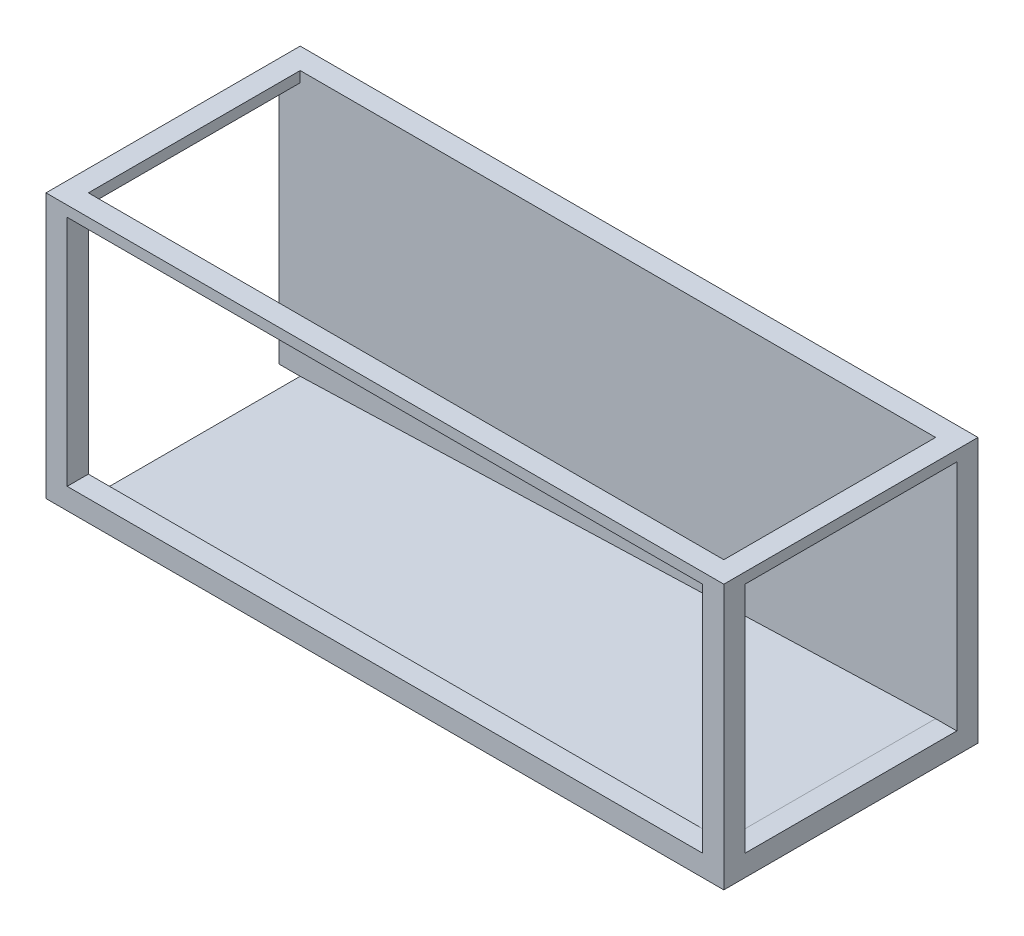
ISO-10303-21;
HEADER;
FILE_DESCRIPTION(('STEP AP214'),'2;1');
FILE_NAME('part.step','',(''),(''),'','','');
FILE_SCHEMA(('AUTOMOTIVE_DESIGN { 1 0 10303 214 1 1 1 1 }'));
ENDSEC;
DATA;
#1=APPLICATION_CONTEXT('core data for automotive mechanical design processes');
#2=APPLICATION_PROTOCOL_DEFINITION('international standard','automotive_design',2000,#1);
#3=PRODUCT_CONTEXT('',#1,'mechanical');
#4=PRODUCT('Part','Part','',(#3));
#5=PRODUCT_RELATED_PRODUCT_CATEGORY('part','',(#4));
#6=PRODUCT_DEFINITION_FORMATION('','',#4);
#7=PRODUCT_DEFINITION_CONTEXT('part definition',#1,'design');
#8=PRODUCT_DEFINITION('design','',#6,#7);
#9=PRODUCT_DEFINITION_SHAPE('','',#8);
#10=(LENGTH_UNIT() NAMED_UNIT(*) SI_UNIT(.MILLI.,.METRE.));
#11=(NAMED_UNIT(*) PLANE_ANGLE_UNIT() SI_UNIT($,.RADIAN.));
#12=(NAMED_UNIT(*) SI_UNIT($,.STERADIAN.) SOLID_ANGLE_UNIT());
#13=UNCERTAINTY_MEASURE_WITH_UNIT(LENGTH_MEASURE(1.E-05),#10,'distance_accuracy_value','');
#14=(GEOMETRIC_REPRESENTATION_CONTEXT(3) GLOBAL_UNCERTAINTY_ASSIGNED_CONTEXT((#13)) GLOBAL_UNIT_ASSIGNED_CONTEXT((#10,
#11,#12)) REPRESENTATION_CONTEXT('',''));
#15=CARTESIAN_POINT('',(0.,0.,0.));
#16=DIRECTION('',(0.,0.,1.));
#17=DIRECTION('',(1.,0.,0.));
#18=AXIS2_PLACEMENT_3D('',#15,#16,#17);
#19=CARTESIAN_POINT('',(-190.5,12.7,-63.5));
#20=DIRECTION('',(0.,0.,1.));
#21=DIRECTION('',(1.,0.,0.));
#22=AXIS2_PLACEMENT_3D('',#19,#20,#21);
#23=PLANE('',#22);
#24=DIRECTION('',(-1.,0.,0.));
#25=VECTOR('',#24,1.);
#26=CARTESIAN_POINT('',(-190.5,0.,-63.5));
#27=LINE('',#26,#25);
#28=CARTESIAN_POINT('',(-190.5,0.,-63.5));
#29=VERTEX_POINT('',#28);
#30=CARTESIAN_POINT('',(-203.2,0.,-63.5));
#31=VERTEX_POINT('',#30);
#32=EDGE_CURVE('E182',#29,#31,#27,.T.);
#33=ORIENTED_EDGE('',*,*,#32,.F.);
#34=DIRECTION('',(-0.999444906979154,-0.0333148302326385,0.));
#35=VECTOR('',#34,1.);
#36=CARTESIAN_POINT('',(190.5,12.7,-63.5));
#37=LINE('',#36,#35);
#38=CARTESIAN_POINT('',(190.5,12.7,-63.5));
#39=VERTEX_POINT('',#38);
#40=EDGE_CURVE('E167',#39,#29,#37,.T.);
#41=ORIENTED_EDGE('',*,*,#40,.F.);
#42=DIRECTION('',(1.,0.,0.));
#43=VECTOR('',#42,1.);
#44=CARTESIAN_POINT('',(0.,12.7,-63.5));
#45=LINE('',#44,#43);
#46=CARTESIAN_POINT('',(203.2,12.7,-63.5));
#47=VERTEX_POINT('',#46);
#48=EDGE_CURVE('E181',#39,#47,#45,.T.);
#49=ORIENTED_EDGE('',*,*,#48,.T.);
#50=DIRECTION('',(0.,-1.,0.));
#51=VECTOR('',#50,1.);
#52=CARTESIAN_POINT('',(203.2,158.75,-63.5));
#53=LINE('',#52,#51);
#54=CARTESIAN_POINT('',(203.2,152.4,-63.5));
#55=VERTEX_POINT('',#54);
#56=EDGE_CURVE('E190',#55,#47,#53,.T.);
#57=ORIENTED_EDGE('',*,*,#56,.F.);
#58=DIRECTION('',(-1.,0.,0.));
#59=VECTOR('',#58,1.);
#60=CARTESIAN_POINT('',(0.,152.4,-63.5));
#61=LINE('',#60,#59);
#62=CARTESIAN_POINT('',(190.5,152.4,-63.5));
#63=VERTEX_POINT('',#62);
#64=EDGE_CURVE('E11',#55,#63,#61,.T.);
#65=ORIENTED_EDGE('',*,*,#64,.T.);
#66=DIRECTION('',(0.,1.,0.));
#67=VECTOR('',#66,1.);
#68=CARTESIAN_POINT('',(190.5,152.4,-63.5));
#69=LINE('',#68,#67);
#70=CARTESIAN_POINT('',(190.5,158.75,-63.5));
#71=VERTEX_POINT('',#70);
#72=EDGE_CURVE('E349',#63,#71,#69,.T.);
#73=ORIENTED_EDGE('',*,*,#72,.T.);
#74=DIRECTION('',(-1.,0.,0.));
#75=VECTOR('',#74,1.);
#76=CARTESIAN_POINT('',(-190.5,158.75,-63.5));
#77=LINE('',#76,#75);
#78=CARTESIAN_POINT('',(-190.5,158.75,-63.5));
#79=VERTEX_POINT('',#78);
#80=EDGE_CURVE('E323',#71,#79,#77,.T.);
#81=ORIENTED_EDGE('',*,*,#80,.T.);
#82=DIRECTION('',(0.,1.,0.));
#83=VECTOR('',#82,1.);
#84=CARTESIAN_POINT('',(-190.5,152.4,-63.5));
#85=LINE('',#84,#83);
#86=CARTESIAN_POINT('',(-190.5,152.4,-63.5));
#87=VERTEX_POINT('',#86);
#88=EDGE_CURVE('E345',#87,#79,#85,.T.);
#89=ORIENTED_EDGE('',*,*,#88,.F.);
#90=DIRECTION('',(1.,0.,0.));
#91=VECTOR('',#90,1.);
#92=CARTESIAN_POINT('',(0.,152.4,-63.5));
#93=LINE('',#92,#91);
#94=CARTESIAN_POINT('',(-203.2,152.4,-63.5));
#95=VERTEX_POINT('',#94);
#96=EDGE_CURVE('E71',#95,#87,#93,.T.);
#97=ORIENTED_EDGE('',*,*,#96,.F.);
#98=DIRECTION('',(0.,-1.,0.));
#99=VECTOR('',#98,1.);
#100=CARTESIAN_POINT('',(-203.2,158.75,-63.5));
#101=LINE('',#100,#99);
#102=EDGE_CURVE('E222',#95,#31,#101,.T.);
#103=ORIENTED_EDGE('',*,*,#102,.T.);
#104=EDGE_LOOP('',(#33,#41,#49,#57,#65,#73,#81,#89,#97,#103));
#105=FACE_BOUND('',#104,.T.);
#106=ADVANCED_FACE('F47',(#105),#23,.T.);
#107=CARTESIAN_POINT('',(-190.5,12.7,63.5));
#108=DIRECTION('',(0.,0.,-1.));
#109=DIRECTION('',(-1.,0.,0.));
#110=AXIS2_PLACEMENT_3D('',#107,#108,#109);
#111=PLANE('',#110);
#112=DIRECTION('',(1.,0.,0.));
#113=VECTOR('',#112,1.);
#114=CARTESIAN_POINT('',(-190.5,12.7,63.5));
#115=LINE('',#114,#113);
#116=CARTESIAN_POINT('',(-190.5,12.7,63.5));
#117=VERTEX_POINT('',#116);
#118=CARTESIAN_POINT('',(190.5,12.7,63.5));
#119=VERTEX_POINT('',#118);
#120=EDGE_CURVE('E176',#117,#119,#115,.T.);
#121=ORIENTED_EDGE('',*,*,#120,.T.);
#122=DIRECTION('',(0.999444906979154,0.0333148302326385,0.));
#123=VECTOR('',#122,1.);
#124=CARTESIAN_POINT('',(190.5,12.7,63.5));
#125=LINE('',#124,#123);
#126=CARTESIAN_POINT('',(-190.5,0.,63.5));
#127=VERTEX_POINT('',#126);
#128=EDGE_CURVE('E169',#127,#119,#125,.T.);
#129=ORIENTED_EDGE('',*,*,#128,.F.);
#130=DIRECTION('',(1.,0.,0.));
#131=VECTOR('',#130,1.);
#132=CARTESIAN_POINT('',(-190.5,0.,63.5));
#133=LINE('',#132,#131);
#134=CARTESIAN_POINT('',(-203.2,0.,63.5));
#135=VERTEX_POINT('',#134);
#136=EDGE_CURVE('E177',#135,#127,#133,.T.);
#137=ORIENTED_EDGE('',*,*,#136,.F.);
#138=DIRECTION('',(0.,-1.,0.));
#139=VECTOR('',#138,1.);
#140=CARTESIAN_POINT('',(-203.2,158.75,63.5));
#141=LINE('',#140,#139);
#142=CARTESIAN_POINT('',(-203.2,152.4,63.5));
#143=VERTEX_POINT('',#142);
#144=EDGE_CURVE('E239',#143,#135,#141,.T.);
#145=ORIENTED_EDGE('',*,*,#144,.F.);
#146=DIRECTION('',(1.,0.,0.));
#147=VECTOR('',#146,1.);
#148=CARTESIAN_POINT('',(0.,152.4,63.5));
#149=LINE('',#148,#147);
#150=CARTESIAN_POINT('',(-190.5,152.4,63.5));
#151=VERTEX_POINT('',#150);
#152=EDGE_CURVE('E197',#143,#151,#149,.T.);
#153=ORIENTED_EDGE('',*,*,#152,.T.);
#154=DIRECTION('',(0.,-1.,0.));
#155=VECTOR('',#154,1.);
#156=CARTESIAN_POINT('',(-190.5,158.75,63.5));
#157=LINE('',#156,#155);
#158=EDGE_CURVE('E243',#151,#117,#157,.T.);
#159=ORIENTED_EDGE('',*,*,#158,.T.);
#160=EDGE_LOOP('',(#121,#129,#137,#145,#153,#159));
#161=FACE_BOUND('',#160,.T.);
#162=ADVANCED_FACE('F381',(#161),#111,.T.);
#163=CARTESIAN_POINT('',(0.,12.7,0.));
#164=DIRECTION('',(0.,-1.,0.));
#165=DIRECTION('',(0.,0.,-1.));
#166=AXIS2_PLACEMENT_3D('',#163,#164,#165);
#167=PLANE('',#166);
#168=ORIENTED_EDGE('',*,*,#48,.F.);
#169=DIRECTION('',(0.,0.,-1.));
#170=VECTOR('',#169,1.);
#171=CARTESIAN_POINT('',(190.5,12.7,63.5));
#172=LINE('',#171,#170);
#173=EDGE_CURVE('E164',#119,#39,#172,.T.);
#174=ORIENTED_EDGE('',*,*,#173,.F.);
#175=DIRECTION('',(1.,0.,0.));
#176=VECTOR('',#175,1.);
#177=CARTESIAN_POINT('',(0.,12.7,63.5));
#178=LINE('',#177,#176);
#179=CARTESIAN_POINT('',(203.2,12.7,63.5));
#180=VERTEX_POINT('',#179);
#181=EDGE_CURVE('E205',#119,#180,#178,.T.);
#182=ORIENTED_EDGE('',*,*,#181,.T.);
#183=DIRECTION('',(0.,0.,-1.));
#184=VECTOR('',#183,1.);
#185=CARTESIAN_POINT('',(203.2,12.7,76.2));
#186=LINE('',#185,#184);
#187=EDGE_CURVE('E188',#180,#47,#186,.T.);
#188=ORIENTED_EDGE('',*,*,#187,.T.);
#189=EDGE_LOOP('',(#168,#174,#182,#188));
#190=FACE_BOUND('',#189,.T.);
#191=ADVANCED_FACE('F186',(#190),#167,.F.);
#192=DIRECTION('',(0.,0.,1.));
#193=VECTOR('',#192,1.);
#194=CARTESIAN_POINT('',(190.5,12.7,0.));
#195=LINE('',#194,#193);
#196=CARTESIAN_POINT('',(190.5,12.7,76.2));
#197=VERTEX_POINT('',#196);
#198=EDGE_CURVE('E195',#119,#197,#195,.T.);
#199=ORIENTED_EDGE('',*,*,#198,.F.);
#200=ORIENTED_EDGE('',*,*,#120,.F.);
#201=DIRECTION('',(0.,0.,1.));
#202=VECTOR('',#201,1.);
#203=CARTESIAN_POINT('',(-190.5,12.7,0.));
#204=LINE('',#203,#202);
#205=CARTESIAN_POINT('',(-190.5,12.7,76.2));
#206=VERTEX_POINT('',#205);
#207=EDGE_CURVE('E225',#117,#206,#204,.T.);
#208=ORIENTED_EDGE('',*,*,#207,.T.);
#209=DIRECTION('',(1.,0.,0.));
#210=VECTOR('',#209,1.);
#211=CARTESIAN_POINT('',(-203.2,12.7,76.2));
#212=LINE('',#211,#210);
#213=EDGE_CURVE('E255',#206,#197,#212,.T.);
#214=ORIENTED_EDGE('',*,*,#213,.T.);
#215=EDGE_LOOP('',(#199,#200,#208,#214));
#216=FACE_BOUND('',#215,.T.);
#217=ADVANCED_FACE('F392',(#216),#167,.F.);
#218=CARTESIAN_POINT('',(0.,0.,0.));
#219=DIRECTION('',(0.,-1.,0.));
#220=DIRECTION('',(0.,0.,-1.));
#221=AXIS2_PLACEMENT_3D('',#218,#219,#220);
#222=PLANE('',#221);
#223=DIRECTION('',(0.,0.,-1.));
#224=VECTOR('',#223,1.);
#225=CARTESIAN_POINT('',(-190.5,0.,444.711607903012));
#226=LINE('',#225,#224);
#227=EDGE_CURVE('E63',#127,#29,#226,.T.);
#228=ORIENTED_EDGE('',*,*,#227,.T.);
#229=ORIENTED_EDGE('',*,*,#32,.T.);
#230=DIRECTION('',(0.,0.,1.));
#231=VECTOR('',#230,1.);
#232=CARTESIAN_POINT('',(-203.2,0.,76.2));
#233=LINE('',#232,#231);
#234=CARTESIAN_POINT('',(-203.2,0.,-76.2));
#235=VERTEX_POINT('',#234);
#236=EDGE_CURVE('E263',#235,#31,#233,.T.);
#237=ORIENTED_EDGE('',*,*,#236,.F.);
#238=DIRECTION('',(-1.,0.,0.));
#239=VECTOR('',#238,1.);
#240=CARTESIAN_POINT('',(-203.2,0.,-76.2));
#241=LINE('',#240,#239);
#242=CARTESIAN_POINT('',(203.2,0.,-76.2));
#243=VERTEX_POINT('',#242);
#244=EDGE_CURVE('E259',#243,#235,#241,.T.);
#245=ORIENTED_EDGE('',*,*,#244,.F.);
#246=DIRECTION('',(0.,0.,-1.));
#247=VECTOR('',#246,1.);
#248=CARTESIAN_POINT('',(203.2,0.,76.2));
#249=LINE('',#248,#247);
#250=CARTESIAN_POINT('',(203.2,0.,76.2));
#251=VERTEX_POINT('',#250);
#252=EDGE_CURVE('E271',#251,#243,#249,.T.);
#253=ORIENTED_EDGE('',*,*,#252,.F.);
#254=DIRECTION('',(1.,0.,0.));
#255=VECTOR('',#254,1.);
#256=CARTESIAN_POINT('',(-203.2,0.,76.2));
#257=LINE('',#256,#255);
#258=CARTESIAN_POINT('',(-203.2,0.,76.2));
#259=VERTEX_POINT('',#258);
#260=EDGE_CURVE('E267',#259,#251,#257,.T.);
#261=ORIENTED_EDGE('',*,*,#260,.F.);
#262=EDGE_CURVE('E249',#135,#259,#233,.T.);
#263=ORIENTED_EDGE('',*,*,#262,.F.);
#264=ORIENTED_EDGE('',*,*,#136,.T.);
#265=EDGE_LOOP('',(#228,#229,#237,#245,#253,#261,#263,#264));
#266=FACE_BOUND('',#265,.T.);
#267=ADVANCED_FACE('F297',(#266),#222,.T.);
#268=CARTESIAN_POINT('',(-203.2,12.7,76.2));
#269=DIRECTION('',(1.,0.,0.));
#270=DIRECTION('',(0.,0.,-1.));
#271=AXIS2_PLACEMENT_3D('',#268,#269,#270);
#272=PLANE('',#271);
#273=ORIENTED_EDGE('',*,*,#236,.T.);
#274=ORIENTED_EDGE('',*,*,#102,.F.);
#275=DIRECTION('',(0.,0.,1.));
#276=VECTOR('',#275,1.);
#277=CARTESIAN_POINT('',(-203.2,152.4,76.2));
#278=LINE('',#277,#276);
#279=EDGE_CURVE('E348',#95,#143,#278,.T.);
#280=ORIENTED_EDGE('',*,*,#279,.T.);
#281=ORIENTED_EDGE('',*,*,#144,.T.);
#282=ORIENTED_EDGE('',*,*,#262,.T.);
#283=DIRECTION('',(0.,-1.,0.));
#284=VECTOR('',#283,1.);
#285=CARTESIAN_POINT('',(-203.2,12.7,76.2));
#286=LINE('',#285,#284);
#287=CARTESIAN_POINT('',(-203.2,158.75,76.2));
#288=VERTEX_POINT('',#287);
#289=EDGE_CURVE('E56',#288,#259,#286,.T.);
#290=ORIENTED_EDGE('',*,*,#289,.F.);
#291=DIRECTION('',(0.,0.,1.));
#292=VECTOR('',#291,1.);
#293=CARTESIAN_POINT('',(-203.2,158.75,0.));
#294=LINE('',#293,#292);
#295=CARTESIAN_POINT('',(-203.2,158.75,-76.2));
#296=VERTEX_POINT('',#295);
#297=EDGE_CURVE('E226',#296,#288,#294,.T.);
#298=ORIENTED_EDGE('',*,*,#297,.F.);
#299=DIRECTION('',(0.,-1.,0.));
#300=VECTOR('',#299,1.);
#301=CARTESIAN_POINT('',(-203.2,12.7,-76.2));
#302=LINE('',#301,#300);
#303=EDGE_CURVE('E262',#296,#235,#302,.T.);
#304=ORIENTED_EDGE('',*,*,#303,.T.);
#305=EDGE_LOOP('',(#273,#274,#280,#281,#282,#290,#298,#304));
#306=FACE_BOUND('',#305,.T.);
#307=ADVANCED_FACE('F49',(#306),#272,.F.);
#308=CARTESIAN_POINT('',(-203.2,12.7,76.2));
#309=DIRECTION('',(0.,0.,-1.));
#310=DIRECTION('',(-1.,0.,0.));
#311=AXIS2_PLACEMENT_3D('',#308,#309,#310);
#312=PLANE('',#311);
#313=DIRECTION('',(1.,0.,0.));
#314=VECTOR('',#313,1.);
#315=CARTESIAN_POINT('',(-203.2,152.4,76.2));
#316=LINE('',#315,#314);
#317=CARTESIAN_POINT('',(-190.5,152.4,76.2));
#318=VERTEX_POINT('',#317);
#319=CARTESIAN_POINT('',(190.5,152.4,76.2));
#320=VERTEX_POINT('',#319);
#321=EDGE_CURVE('E360',#318,#320,#316,.T.);
#322=ORIENTED_EDGE('',*,*,#321,.T.);
#323=DIRECTION('',(0.,-1.,0.));
#324=VECTOR('',#323,1.);
#325=CARTESIAN_POINT('',(190.5,158.75,76.2));
#326=LINE('',#325,#324);
#327=EDGE_CURVE('E216',#320,#197,#326,.T.);
#328=ORIENTED_EDGE('',*,*,#327,.T.);
#329=ORIENTED_EDGE('',*,*,#213,.F.);
#330=DIRECTION('',(0.,-1.,0.));
#331=VECTOR('',#330,1.);
#332=CARTESIAN_POINT('',(-190.5,158.75,76.2));
#333=LINE('',#332,#331);
#334=EDGE_CURVE('E233',#318,#206,#333,.T.);
#335=ORIENTED_EDGE('',*,*,#334,.F.);
#336=EDGE_LOOP('',(#322,#328,#329,#335));
#337=FACE_BOUND('',#336,.T.);
#338=ORIENTED_EDGE('',*,*,#260,.T.);
#339=DIRECTION('',(0.,-1.,0.));
#340=VECTOR('',#339,1.);
#341=CARTESIAN_POINT('',(203.2,12.7,76.2));
#342=LINE('',#341,#340);
#343=CARTESIAN_POINT('',(203.2,158.75,76.2));
#344=VERTEX_POINT('',#343);
#345=EDGE_CURVE('E283',#344,#251,#342,.T.);
#346=ORIENTED_EDGE('',*,*,#345,.F.);
#347=DIRECTION('',(1.,0.,0.));
#348=VECTOR('',#347,1.);
#349=CARTESIAN_POINT('',(0.,158.75,76.2));
#350=LINE('',#349,#348);
#351=EDGE_CURVE('E229',#288,#344,#350,.T.);
#352=ORIENTED_EDGE('',*,*,#351,.F.);
#353=ORIENTED_EDGE('',*,*,#289,.T.);
#354=EDGE_LOOP('',(#338,#346,#352,#353));
#355=FACE_BOUND('',#354,.T.);
#356=ADVANCED_FACE('F291',(#337,#355),#312,.F.);
#357=CARTESIAN_POINT('',(203.2,12.7,76.2));
#358=DIRECTION('',(-1.,0.,0.));
#359=DIRECTION('',(0.,0.,1.));
#360=AXIS2_PLACEMENT_3D('',#357,#358,#359);
#361=PLANE('',#360);
#362=DIRECTION('',(0.,0.,-1.));
#363=VECTOR('',#362,1.);
#364=CARTESIAN_POINT('',(203.2,152.4,76.2));
#365=LINE('',#364,#363);
#366=CARTESIAN_POINT('',(203.2,152.4,63.5));
#367=VERTEX_POINT('',#366);
#368=EDGE_CURVE('E364',#367,#55,#365,.T.);
#369=ORIENTED_EDGE('',*,*,#368,.T.);
#370=ORIENTED_EDGE('',*,*,#56,.T.);
#371=ORIENTED_EDGE('',*,*,#187,.F.);
#372=DIRECTION('',(0.,-1.,0.));
#373=VECTOR('',#372,1.);
#374=CARTESIAN_POINT('',(203.2,158.75,63.5));
#375=LINE('',#374,#373);
#376=EDGE_CURVE('E213',#367,#180,#375,.T.);
#377=ORIENTED_EDGE('',*,*,#376,.F.);
#378=EDGE_LOOP('',(#369,#370,#371,#377));
#379=FACE_BOUND('',#378,.T.);
#380=DIRECTION('',(0.,0.,1.));
#381=VECTOR('',#380,1.);
#382=CARTESIAN_POINT('',(203.2,158.75,0.));
#383=LINE('',#382,#381);
#384=CARTESIAN_POINT('',(203.2,158.75,-76.2));
#385=VERTEX_POINT('',#384);
#386=EDGE_CURVE('E201',#385,#344,#383,.T.);
#387=ORIENTED_EDGE('',*,*,#386,.T.);
#388=ORIENTED_EDGE('',*,*,#345,.T.);
#389=ORIENTED_EDGE('',*,*,#252,.T.);
#390=DIRECTION('',(0.,-1.,0.));
#391=VECTOR('',#390,1.);
#392=CARTESIAN_POINT('',(203.2,12.7,-76.2));
#393=LINE('',#392,#391);
#394=EDGE_CURVE('E279',#385,#243,#393,.T.);
#395=ORIENTED_EDGE('',*,*,#394,.F.);
#396=EDGE_LOOP('',(#387,#388,#389,#395));
#397=FACE_BOUND('',#396,.T.);
#398=ADVANCED_FACE('F302',(#379,#397),#361,.F.);
#399=CARTESIAN_POINT('',(-203.2,12.7,-76.2));
#400=DIRECTION('',(0.,0.,1.));
#401=DIRECTION('',(1.,0.,0.));
#402=AXIS2_PLACEMENT_3D('',#399,#400,#401);
#403=PLANE('',#402);
#404=ORIENTED_EDGE('',*,*,#244,.T.);
#405=ORIENTED_EDGE('',*,*,#303,.F.);
#406=DIRECTION('',(1.,0.,0.));
#407=VECTOR('',#406,1.);
#408=CARTESIAN_POINT('',(0.,158.75,-76.2));
#409=LINE('',#408,#407);
#410=EDGE_CURVE('E219',#296,#385,#409,.T.);
#411=ORIENTED_EDGE('',*,*,#410,.T.);
#412=ORIENTED_EDGE('',*,*,#394,.T.);
#413=EDGE_LOOP('',(#404,#405,#411,#412));
#414=FACE_BOUND('',#413,.T.);
#415=ADVANCED_FACE('F304',(#414),#403,.F.);
#416=CARTESIAN_POINT('',(-190.5,158.75,0.));
#417=DIRECTION('',(1.,0.,0.));
#418=DIRECTION('',(0.,0.,-1.));
#419=AXIS2_PLACEMENT_3D('',#416,#417,#418);
#420=PLANE('',#419);
#421=DIRECTION('',(0.,0.,-1.));
#422=VECTOR('',#421,1.);
#423=CARTESIAN_POINT('',(-190.5,152.4,0.));
#424=LINE('',#423,#422);
#425=EDGE_CURVE('E191',#318,#151,#424,.T.);
#426=ORIENTED_EDGE('',*,*,#425,.F.);
#427=ORIENTED_EDGE('',*,*,#334,.T.);
#428=ORIENTED_EDGE('',*,*,#207,.F.);
#429=ORIENTED_EDGE('',*,*,#158,.F.);
#430=EDGE_LOOP('',(#426,#427,#428,#429));
#431=FACE_BOUND('',#430,.T.);
#432=ADVANCED_FACE('F387',(#431),#420,.T.);
#433=CARTESIAN_POINT('',(0.,158.75,0.));
#434=DIRECTION('',(0.,1.,0.));
#435=DIRECTION('',(0.,0.,1.));
#436=AXIS2_PLACEMENT_3D('',#433,#434,#435);
#437=PLANE('',#436);
#438=ORIENTED_EDGE('',*,*,#80,.F.);
#439=DIRECTION('',(0.,0.,-1.));
#440=VECTOR('',#439,1.);
#441=CARTESIAN_POINT('',(190.5,158.75,63.5));
#442=LINE('',#441,#440);
#443=CARTESIAN_POINT('',(190.5,158.75,63.5));
#444=VERTEX_POINT('',#443);
#445=EDGE_CURVE('E338',#444,#71,#442,.T.);
#446=ORIENTED_EDGE('',*,*,#445,.F.);
#447=DIRECTION('',(1.,0.,0.));
#448=VECTOR('',#447,1.);
#449=CARTESIAN_POINT('',(-190.5,158.75,63.5));
#450=LINE('',#449,#448);
#451=CARTESIAN_POINT('',(-190.5,158.75,63.5));
#452=VERTEX_POINT('',#451);
#453=EDGE_CURVE('E334',#452,#444,#450,.T.);
#454=ORIENTED_EDGE('',*,*,#453,.F.);
#455=DIRECTION('',(0.,0.,1.));
#456=VECTOR('',#455,1.);
#457=CARTESIAN_POINT('',(-190.5,158.75,63.5));
#458=LINE('',#457,#456);
#459=EDGE_CURVE('E315',#79,#452,#458,.T.);
#460=ORIENTED_EDGE('',*,*,#459,.F.);
#461=EDGE_LOOP('',(#438,#446,#454,#460));
#462=FACE_BOUND('',#461,.T.);
#463=ORIENTED_EDGE('',*,*,#351,.T.);
#464=ORIENTED_EDGE('',*,*,#386,.F.);
#465=ORIENTED_EDGE('',*,*,#410,.F.);
#466=ORIENTED_EDGE('',*,*,#297,.T.);
#467=EDGE_LOOP('',(#463,#464,#465,#466));
#468=FACE_BOUND('',#467,.T.);
#469=ADVANCED_FACE('F309',(#462,#468),#437,.T.);
#470=CARTESIAN_POINT('',(190.5,158.75,0.));
#471=DIRECTION('',(1.,0.,0.));
#472=DIRECTION('',(0.,0.,-1.));
#473=AXIS2_PLACEMENT_3D('',#470,#471,#472);
#474=PLANE('',#473);
#475=ORIENTED_EDGE('',*,*,#327,.F.);
#476=DIRECTION('',(0.,0.,-1.));
#477=VECTOR('',#476,1.);
#478=CARTESIAN_POINT('',(190.5,152.4,0.));
#479=LINE('',#478,#477);
#480=CARTESIAN_POINT('',(190.5,152.4,63.5));
#481=VERTEX_POINT('',#480);
#482=EDGE_CURVE('E372',#320,#481,#479,.T.);
#483=ORIENTED_EDGE('',*,*,#482,.T.);
#484=DIRECTION('',(0.,-1.,0.));
#485=VECTOR('',#484,1.);
#486=CARTESIAN_POINT('',(190.5,158.75,63.5));
#487=LINE('',#486,#485);
#488=EDGE_CURVE('E204',#481,#119,#487,.T.);
#489=ORIENTED_EDGE('',*,*,#488,.T.);
#490=ORIENTED_EDGE('',*,*,#198,.T.);
#491=EDGE_LOOP('',(#475,#483,#489,#490));
#492=FACE_BOUND('',#491,.T.);
#493=ADVANCED_FACE('F396',(#492),#474,.F.);
#494=CARTESIAN_POINT('',(0.,158.75,63.5));
#495=DIRECTION('',(0.,0.,-1.));
#496=DIRECTION('',(-1.,0.,0.));
#497=AXIS2_PLACEMENT_3D('',#494,#495,#496);
#498=PLANE('',#497);
#499=DIRECTION('',(-1.,0.,0.));
#500=VECTOR('',#499,1.);
#501=CARTESIAN_POINT('',(0.,152.4,63.5));
#502=LINE('',#501,#500);
#503=EDGE_CURVE('E368',#367,#481,#502,.T.);
#504=ORIENTED_EDGE('',*,*,#503,.F.);
#505=ORIENTED_EDGE('',*,*,#376,.T.);
#506=ORIENTED_EDGE('',*,*,#181,.F.);
#507=ORIENTED_EDGE('',*,*,#488,.F.);
#508=EDGE_LOOP('',(#504,#505,#506,#507));
#509=FACE_BOUND('',#508,.T.);
#510=ADVANCED_FACE('F422',(#509),#498,.T.);
#511=CARTESIAN_POINT('',(0.,152.4,0.));
#512=DIRECTION('',(0.,-1.,0.));
#513=DIRECTION('',(0.,0.,-1.));
#514=AXIS2_PLACEMENT_3D('',#511,#512,#513);
#515=PLANE('',#514);
#516=ORIENTED_EDGE('',*,*,#152,.F.);
#517=ORIENTED_EDGE('',*,*,#279,.F.);
#518=ORIENTED_EDGE('',*,*,#96,.T.);
#519=DIRECTION('',(0.,0.,1.));
#520=VECTOR('',#519,1.);
#521=CARTESIAN_POINT('',(-190.5,152.4,63.5));
#522=LINE('',#521,#520);
#523=EDGE_CURVE('E318',#87,#151,#522,.T.);
#524=ORIENTED_EDGE('',*,*,#523,.T.);
#525=EDGE_LOOP('',(#516,#517,#518,#524));
#526=FACE_BOUND('',#525,.T.);
#527=ADVANCED_FACE('F406',(#526),#515,.T.);
#528=ORIENTED_EDGE('',*,*,#321,.F.);
#529=ORIENTED_EDGE('',*,*,#425,.T.);
#530=DIRECTION('',(1.,0.,0.));
#531=VECTOR('',#530,1.);
#532=CARTESIAN_POINT('',(-190.5,152.4,63.5));
#533=LINE('',#532,#531);
#534=EDGE_CURVE('E322',#151,#481,#533,.T.);
#535=ORIENTED_EDGE('',*,*,#534,.T.);
#536=ORIENTED_EDGE('',*,*,#482,.F.);
#537=EDGE_LOOP('',(#528,#529,#535,#536));
#538=FACE_BOUND('',#537,.T.);
#539=ADVANCED_FACE('F399',(#538),#515,.T.);
#540=ORIENTED_EDGE('',*,*,#368,.F.);
#541=ORIENTED_EDGE('',*,*,#503,.T.);
#542=DIRECTION('',(0.,0.,-1.));
#543=VECTOR('',#542,1.);
#544=CARTESIAN_POINT('',(190.5,152.4,63.5));
#545=LINE('',#544,#543);
#546=EDGE_CURVE('E327',#481,#63,#545,.T.);
#547=ORIENTED_EDGE('',*,*,#546,.T.);
#548=ORIENTED_EDGE('',*,*,#64,.F.);
#549=EDGE_LOOP('',(#540,#541,#547,#548));
#550=FACE_BOUND('',#549,.T.);
#551=ADVANCED_FACE('F418',(#550),#515,.T.);
#552=CARTESIAN_POINT('',(-190.5,152.4,63.5));
#553=DIRECTION('',(-1.,0.,0.));
#554=DIRECTION('',(0.,0.,1.));
#555=AXIS2_PLACEMENT_3D('',#552,#553,#554);
#556=PLANE('',#555);
#557=ORIENTED_EDGE('',*,*,#459,.T.);
#558=DIRECTION('',(0.,1.,0.));
#559=VECTOR('',#558,1.);
#560=CARTESIAN_POINT('',(-190.5,152.4,63.5));
#561=LINE('',#560,#559);
#562=EDGE_CURVE('E331',#151,#452,#561,.T.);
#563=ORIENTED_EDGE('',*,*,#562,.F.);
#564=ORIENTED_EDGE('',*,*,#523,.F.);
#565=ORIENTED_EDGE('',*,*,#88,.T.);
#566=EDGE_LOOP('',(#557,#563,#564,#565));
#567=FACE_BOUND('',#566,.T.);
#568=ADVANCED_FACE('F408',(#567),#556,.F.);
#569=CARTESIAN_POINT('',(190.5,152.4,63.5));
#570=DIRECTION('',(1.,0.,0.));
#571=DIRECTION('',(0.,0.,-1.));
#572=AXIS2_PLACEMENT_3D('',#569,#570,#571);
#573=PLANE('',#572);
#574=ORIENTED_EDGE('',*,*,#445,.T.);
#575=ORIENTED_EDGE('',*,*,#72,.F.);
#576=ORIENTED_EDGE('',*,*,#546,.F.);
#577=DIRECTION('',(0.,1.,0.));
#578=VECTOR('',#577,1.);
#579=CARTESIAN_POINT('',(190.5,152.4,63.5));
#580=LINE('',#579,#578);
#581=EDGE_CURVE('E352',#481,#444,#580,.T.);
#582=ORIENTED_EDGE('',*,*,#581,.T.);
#583=EDGE_LOOP('',(#574,#575,#576,#582));
#584=FACE_BOUND('',#583,.T.);
#585=ADVANCED_FACE('F414',(#584),#573,.F.);
#586=CARTESIAN_POINT('',(-190.5,152.4,63.5));
#587=DIRECTION('',(0.,0.,1.));
#588=DIRECTION('',(1.,0.,0.));
#589=AXIS2_PLACEMENT_3D('',#586,#587,#588);
#590=PLANE('',#589);
#591=ORIENTED_EDGE('',*,*,#453,.T.);
#592=ORIENTED_EDGE('',*,*,#581,.F.);
#593=ORIENTED_EDGE('',*,*,#534,.F.);
#594=ORIENTED_EDGE('',*,*,#562,.T.);
#595=EDGE_LOOP('',(#591,#592,#593,#594));
#596=FACE_BOUND('',#595,.T.);
#597=ADVANCED_FACE('F404',(#596),#590,.F.);
#598=CARTESIAN_POINT('',(190.5,12.7,444.711607903012));
#599=DIRECTION('',(0.0333148302326385,-0.999444906979154,0.));
#600=DIRECTION('',(0.999444906979154,0.0333148302326385,0.));
#601=AXIS2_PLACEMENT_3D('',#598,#599,#600);
#602=PLANE('',#601);
#603=ORIENTED_EDGE('',*,*,#227,.F.);
#604=ORIENTED_EDGE('',*,*,#128,.T.);
#605=ORIENTED_EDGE('',*,*,#173,.T.);
#606=ORIENTED_EDGE('',*,*,#40,.T.);
#607=EDGE_LOOP('',(#603,#604,#605,#606));
#608=FACE_BOUND('',#607,.T.);
#609=ADVANCED_FACE('F166',(#608),#602,.F.);
#610=CLOSED_SHELL('',(#106,#162,#191,#217,#267,#307,#356,#398,#415,#432,#469,#493,#510,#527,
#539,#551,#568,#585,#597,#609));
#611=MANIFOLD_SOLID_BREP('B2',#610);
#612=ADVANCED_BREP_SHAPE_REPRESENTATION('',(#18,#611),#14);
#613=SHAPE_DEFINITION_REPRESENTATION(#9,#612);
ENDSEC;
END-ISO-10303-21;
